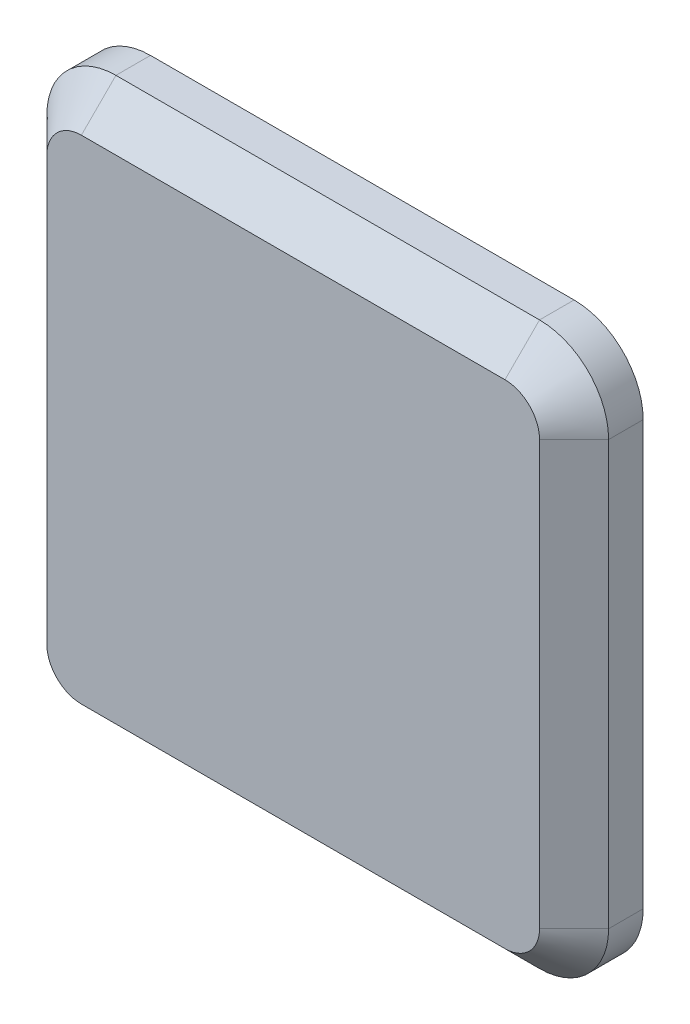
ISO-10303-21;
HEADER;
FILE_DESCRIPTION(('STEP AP214'),'2;1');
FILE_NAME('part.step','',(''),(''),'','','');
FILE_SCHEMA(('AUTOMOTIVE_DESIGN { 1 0 10303 214 1 1 1 1 }'));
ENDSEC;
DATA;
#1=APPLICATION_CONTEXT('core data for automotive mechanical design processes');
#2=APPLICATION_PROTOCOL_DEFINITION('international standard','automotive_design',2000,#1);
#3=PRODUCT_CONTEXT('',#1,'mechanical');
#4=PRODUCT('Part','Part','',(#3));
#5=PRODUCT_RELATED_PRODUCT_CATEGORY('part','',(#4));
#6=PRODUCT_DEFINITION_FORMATION('','',#4);
#7=PRODUCT_DEFINITION_CONTEXT('part definition',#1,'design');
#8=PRODUCT_DEFINITION('design','',#6,#7);
#9=PRODUCT_DEFINITION_SHAPE('','',#8);
#10=(LENGTH_UNIT() NAMED_UNIT(*) SI_UNIT(.MILLI.,.METRE.));
#11=(NAMED_UNIT(*) PLANE_ANGLE_UNIT() SI_UNIT($,.RADIAN.));
#12=(NAMED_UNIT(*) SI_UNIT($,.STERADIAN.) SOLID_ANGLE_UNIT());
#13=UNCERTAINTY_MEASURE_WITH_UNIT(LENGTH_MEASURE(1.E-05),#10,'distance_accuracy_value','');
#14=(GEOMETRIC_REPRESENTATION_CONTEXT(3) GLOBAL_UNCERTAINTY_ASSIGNED_CONTEXT((#13)) GLOBAL_UNIT_ASSIGNED_CONTEXT((#10,
#11,#12)) REPRESENTATION_CONTEXT('',''));
#15=CARTESIAN_POINT('',(0.,0.,0.));
#16=DIRECTION('',(0.,0.,1.));
#17=DIRECTION('',(1.,0.,0.));
#18=AXIS2_PLACEMENT_3D('',#15,#16,#17);
#19=CARTESIAN_POINT('',(-16.2634559672906,-16.2634559672906,4.));
#20=DIRECTION('',(1.,0.,0.));
#21=DIRECTION('',(0.,0.,-1.));
#22=AXIS2_PLACEMENT_3D('',#19,#20,#21);
#23=PLANE('',#22);
#24=DIRECTION('',(0.,0.,-1.));
#25=VECTOR('',#24,1.);
#26=CARTESIAN_POINT('',(-16.2634559672906,-12.2634559672906,4.));
#27=LINE('',#26,#25);
#28=CARTESIAN_POINT('',(-16.2634559672906,-12.2634559672906,0.));
#29=VERTEX_POINT('',#28);
#30=CARTESIAN_POINT('',(-16.2634559672906,-12.2634559672906,2.));
#31=VERTEX_POINT('',#30);
#32=EDGE_CURVE('E142',#29,#31,#27,.F.);
#33=ORIENTED_EDGE('',*,*,#32,.T.);
#34=DIRECTION('',(0.,1.,0.));
#35=VECTOR('',#34,1.);
#36=CARTESIAN_POINT('',(-16.2634559672906,12.2634559672906,2.));
#37=LINE('',#36,#35);
#38=CARTESIAN_POINT('',(-16.2634559672906,12.2634559672906,2.));
#39=VERTEX_POINT('',#38);
#40=EDGE_CURVE('E202',#31,#39,#37,.T.);
#41=ORIENTED_EDGE('',*,*,#40,.T.);
#42=DIRECTION('',(0.,0.,-1.));
#43=VECTOR('',#42,1.);
#44=CARTESIAN_POINT('',(-16.2634559672906,12.2634559672906,4.));
#45=LINE('',#44,#43);
#46=CARTESIAN_POINT('',(-16.2634559672906,12.2634559672906,0.));
#47=VERTEX_POINT('',#46);
#48=EDGE_CURVE('E146',#39,#47,#45,.T.);
#49=ORIENTED_EDGE('',*,*,#48,.T.);
#50=DIRECTION('',(0.,-1.,0.));
#51=VECTOR('',#50,1.);
#52=CARTESIAN_POINT('',(-16.2634559672906,-16.2634559672906,0.));
#53=LINE('',#52,#51);
#54=EDGE_CURVE('E153',#47,#29,#53,.T.);
#55=ORIENTED_EDGE('',*,*,#54,.T.);
#56=EDGE_LOOP('',(#33,#41,#49,#55));
#57=FACE_BOUND('',#56,.T.);
#58=ADVANCED_FACE('F34',(#57),#23,.F.);
#59=CARTESIAN_POINT('',(16.2634559672906,-16.2634559672906,4.));
#60=DIRECTION('',(0.,1.,0.));
#61=DIRECTION('',(-1.,0.,0.));
#62=AXIS2_PLACEMENT_3D('',#59,#60,#61);
#63=PLANE('',#62);
#64=DIRECTION('',(0.,0.,-1.));
#65=VECTOR('',#64,1.);
#66=CARTESIAN_POINT('',(12.2634559672906,-16.2634559672906,4.));
#67=LINE('',#66,#65);
#68=CARTESIAN_POINT('',(12.2634559672906,-16.2634559672906,0.));
#69=VERTEX_POINT('',#68);
#70=CARTESIAN_POINT('',(12.2634559672906,-16.2634559672906,2.));
#71=VERTEX_POINT('',#70);
#72=EDGE_CURVE('E136',#69,#71,#67,.F.);
#73=ORIENTED_EDGE('',*,*,#72,.T.);
#74=DIRECTION('',(-1.,0.,0.));
#75=VECTOR('',#74,1.);
#76=CARTESIAN_POINT('',(-12.2634559672906,-16.2634559672906,2.));
#77=LINE('',#76,#75);
#78=CARTESIAN_POINT('',(-12.2634559672906,-16.2634559672906,2.));
#79=VERTEX_POINT('',#78);
#80=EDGE_CURVE('E133',#71,#79,#77,.T.);
#81=ORIENTED_EDGE('',*,*,#80,.T.);
#82=DIRECTION('',(0.,0.,-1.));
#83=VECTOR('',#82,1.);
#84=CARTESIAN_POINT('',(-12.2634559672906,-16.2634559672906,4.));
#85=LINE('',#84,#83);
#86=CARTESIAN_POINT('',(-12.2634559672906,-16.2634559672906,0.));
#87=VERTEX_POINT('',#86);
#88=EDGE_CURVE('E125',#79,#87,#85,.T.);
#89=ORIENTED_EDGE('',*,*,#88,.T.);
#90=DIRECTION('',(1.,0.,0.));
#91=VECTOR('',#90,1.);
#92=CARTESIAN_POINT('',(16.2634559672906,-16.2634559672906,0.));
#93=LINE('',#92,#91);
#94=EDGE_CURVE('E130',#87,#69,#93,.T.);
#95=ORIENTED_EDGE('',*,*,#94,.T.);
#96=EDGE_LOOP('',(#73,#81,#89,#95));
#97=FACE_BOUND('',#96,.T.);
#98=ADVANCED_FACE('F128',(#97),#63,.F.);
#99=CARTESIAN_POINT('',(16.2634559672906,-16.2634559672906,4.));
#100=DIRECTION('',(-1.,0.,0.));
#101=DIRECTION('',(0.,0.,1.));
#102=AXIS2_PLACEMENT_3D('',#99,#100,#101);
#103=PLANE('',#102);
#104=DIRECTION('',(0.,0.,-1.));
#105=VECTOR('',#104,1.);
#106=CARTESIAN_POINT('',(16.2634559672906,12.2634559672906,4.));
#107=LINE('',#106,#105);
#108=CARTESIAN_POINT('',(16.2634559672906,12.2634559672906,0.));
#109=VERTEX_POINT('',#108);
#110=CARTESIAN_POINT('',(16.2634559672906,12.2634559672906,2.));
#111=VERTEX_POINT('',#110);
#112=EDGE_CURVE('E169',#109,#111,#107,.F.);
#113=ORIENTED_EDGE('',*,*,#112,.T.);
#114=DIRECTION('',(0.,-1.,0.));
#115=VECTOR('',#114,1.);
#116=CARTESIAN_POINT('',(16.2634559672906,-12.2634559672906,2.));
#117=LINE('',#116,#115);
#118=CARTESIAN_POINT('',(16.2634559672906,-12.2634559672906,2.));
#119=VERTEX_POINT('',#118);
#120=EDGE_CURVE('E200',#111,#119,#117,.T.);
#121=ORIENTED_EDGE('',*,*,#120,.T.);
#122=DIRECTION('',(0.,0.,-1.));
#123=VECTOR('',#122,1.);
#124=CARTESIAN_POINT('',(16.2634559672906,-12.2634559672906,4.));
#125=LINE('',#124,#123);
#126=CARTESIAN_POINT('',(16.2634559672906,-12.2634559672906,0.));
#127=VERTEX_POINT('',#126);
#128=EDGE_CURVE('E172',#119,#127,#125,.T.);
#129=ORIENTED_EDGE('',*,*,#128,.T.);
#130=DIRECTION('',(0.,1.,0.));
#131=VECTOR('',#130,1.);
#132=CARTESIAN_POINT('',(16.2634559672906,-16.2634559672906,0.));
#133=LINE('',#132,#131);
#134=EDGE_CURVE('E152',#127,#109,#133,.T.);
#135=ORIENTED_EDGE('',*,*,#134,.T.);
#136=EDGE_LOOP('',(#113,#121,#129,#135));
#137=FACE_BOUND('',#136,.T.);
#138=ADVANCED_FACE('F244',(#137),#103,.F.);
#139=CARTESIAN_POINT('',(16.2634559672906,16.2634559672906,4.));
#140=DIRECTION('',(0.,-1.,0.));
#141=DIRECTION('',(1.,0.,0.));
#142=AXIS2_PLACEMENT_3D('',#139,#140,#141);
#143=PLANE('',#142);
#144=DIRECTION('',(0.,0.,-1.));
#145=VECTOR('',#144,1.);
#146=CARTESIAN_POINT('',(-12.2634559672906,16.2634559672906,4.));
#147=LINE('',#146,#145);
#148=CARTESIAN_POINT('',(-12.2634559672906,16.2634559672906,0.));
#149=VERTEX_POINT('',#148);
#150=CARTESIAN_POINT('',(-12.2634559672906,16.2634559672906,2.));
#151=VERTEX_POINT('',#150);
#152=EDGE_CURVE('E174',#149,#151,#147,.F.);
#153=ORIENTED_EDGE('',*,*,#152,.T.);
#154=DIRECTION('',(1.,0.,0.));
#155=VECTOR('',#154,1.);
#156=CARTESIAN_POINT('',(12.2634559672906,16.2634559672906,2.));
#157=LINE('',#156,#155);
#158=CARTESIAN_POINT('',(12.2634559672906,16.2634559672906,2.));
#159=VERTEX_POINT('',#158);
#160=EDGE_CURVE('E11',#151,#159,#157,.T.);
#161=ORIENTED_EDGE('',*,*,#160,.T.);
#162=DIRECTION('',(0.,0.,-1.));
#163=VECTOR('',#162,1.);
#164=CARTESIAN_POINT('',(12.2634559672906,16.2634559672906,4.));
#165=LINE('',#164,#163);
#166=CARTESIAN_POINT('',(12.2634559672906,16.2634559672906,0.));
#167=VERTEX_POINT('',#166);
#168=EDGE_CURVE('E176',#159,#167,#165,.T.);
#169=ORIENTED_EDGE('',*,*,#168,.T.);
#170=DIRECTION('',(-1.,0.,0.));
#171=VECTOR('',#170,1.);
#172=CARTESIAN_POINT('',(16.2634559672906,16.2634559672906,0.));
#173=LINE('',#172,#171);
#174=EDGE_CURVE('E156',#167,#149,#173,.T.);
#175=ORIENTED_EDGE('',*,*,#174,.T.);
#176=EDGE_LOOP('',(#153,#161,#169,#175));
#177=FACE_BOUND('',#176,.T.);
#178=ADVANCED_FACE('F248',(#177),#143,.F.);
#179=CARTESIAN_POINT('',(0.,0.,4.));
#180=DIRECTION('',(0.,0.,1.));
#181=DIRECTION('',(1.,0.,0.));
#182=AXIS2_PLACEMENT_3D('',#179,#180,#181);
#183=PLANE('',#182);
#184=CARTESIAN_POINT('',(-12.2634559672906,-12.2634559672906,4.));
#185=DIRECTION('',(0.,0.,1.));
#186=DIRECTION('',(1.,0.,0.));
#187=AXIS2_PLACEMENT_3D('',#184,#185,#186);
#188=CIRCLE('',#187,2.00000000000001);
#189=CARTESIAN_POINT('',(-14.2634559672906,-12.2634559672906,4.));
#190=VERTEX_POINT('',#189);
#191=CARTESIAN_POINT('',(-12.2634559672906,-14.2634559672906,4.));
#192=VERTEX_POINT('',#191);
#193=EDGE_CURVE('E188',#190,#192,#188,.T.);
#194=ORIENTED_EDGE('',*,*,#193,.T.);
#195=DIRECTION('',(1.,0.,0.));
#196=VECTOR('',#195,1.);
#197=CARTESIAN_POINT('',(12.2634559672906,-14.2634559672906,4.));
#198=LINE('',#197,#196);
#199=CARTESIAN_POINT('',(12.2634559672906,-14.2634559672906,4.));
#200=VERTEX_POINT('',#199);
#201=EDGE_CURVE('E192',#192,#200,#198,.T.);
#202=ORIENTED_EDGE('',*,*,#201,.T.);
#203=CARTESIAN_POINT('',(12.2634559672906,-12.2634559672906,4.));
#204=DIRECTION('',(0.,0.,1.));
#205=DIRECTION('',(1.,0.,0.));
#206=AXIS2_PLACEMENT_3D('',#203,#204,#205);
#207=CIRCLE('',#206,2.00000000000001);
#208=CARTESIAN_POINT('',(14.2634559672906,-12.2634559672906,4.));
#209=VERTEX_POINT('',#208);
#210=EDGE_CURVE('E190',#200,#209,#207,.T.);
#211=ORIENTED_EDGE('',*,*,#210,.T.);
#212=DIRECTION('',(0.,1.,0.));
#213=VECTOR('',#212,1.);
#214=CARTESIAN_POINT('',(14.2634559672906,12.2634559672906,4.));
#215=LINE('',#214,#213);
#216=CARTESIAN_POINT('',(14.2634559672906,12.2634559672906,4.));
#217=VERTEX_POINT('',#216);
#218=EDGE_CURVE('E186',#209,#217,#215,.T.);
#219=ORIENTED_EDGE('',*,*,#218,.T.);
#220=CARTESIAN_POINT('',(12.2634559672906,12.2634559672906,4.));
#221=DIRECTION('',(0.,0.,1.));
#222=DIRECTION('',(1.,0.,0.));
#223=AXIS2_PLACEMENT_3D('',#220,#221,#222);
#224=CIRCLE('',#223,2.00000000000001);
#225=CARTESIAN_POINT('',(12.2634559672906,14.2634559672906,4.));
#226=VERTEX_POINT('',#225);
#227=EDGE_CURVE('E182',#217,#226,#224,.T.);
#228=ORIENTED_EDGE('',*,*,#227,.T.);
#229=DIRECTION('',(-1.,0.,0.));
#230=VECTOR('',#229,1.);
#231=CARTESIAN_POINT('',(-12.2634559672906,14.2634559672906,4.));
#232=LINE('',#231,#230);
#233=CARTESIAN_POINT('',(-12.2634559672906,14.2634559672906,4.));
#234=VERTEX_POINT('',#233);
#235=EDGE_CURVE('E178',#226,#234,#232,.T.);
#236=ORIENTED_EDGE('',*,*,#235,.T.);
#237=CARTESIAN_POINT('',(-12.2634559672906,12.2634559672906,4.));
#238=DIRECTION('',(0.,0.,1.));
#239=DIRECTION('',(1.,0.,0.));
#240=AXIS2_PLACEMENT_3D('',#237,#238,#239);
#241=CIRCLE('',#240,2.00000000000001);
#242=CARTESIAN_POINT('',(-14.2634559672906,12.2634559672906,4.));
#243=VERTEX_POINT('',#242);
#244=EDGE_CURVE('E180',#234,#243,#241,.T.);
#245=ORIENTED_EDGE('',*,*,#244,.T.);
#246=DIRECTION('',(0.,-1.,0.));
#247=VECTOR('',#246,1.);
#248=CARTESIAN_POINT('',(-14.2634559672906,-12.2634559672906,4.));
#249=LINE('',#248,#247);
#250=EDGE_CURVE('E184',#243,#190,#249,.T.);
#251=ORIENTED_EDGE('',*,*,#250,.T.);
#252=EDGE_LOOP('',(#194,#202,#211,#219,#228,#236,#245,#251));
#253=FACE_BOUND('',#252,.T.);
#254=ADVANCED_FACE('F263',(#253),#183,.T.);
#255=CARTESIAN_POINT('',(0.,0.,0.));
#256=DIRECTION('',(0.,0.,1.));
#257=DIRECTION('',(1.,0.,0.));
#258=AXIS2_PLACEMENT_3D('',#255,#256,#257);
#259=PLANE('',#258);
#260=ORIENTED_EDGE('',*,*,#94,.F.);
#261=CARTESIAN_POINT('',(-12.2634559672906,-12.2634559672906,0.));
#262=DIRECTION('',(0.,0.,1.));
#263=DIRECTION('',(1.,0.,0.));
#264=AXIS2_PLACEMENT_3D('',#261,#262,#263);
#265=CIRCLE('',#264,4.);
#266=EDGE_CURVE('E139',#87,#29,#265,.F.);
#267=ORIENTED_EDGE('',*,*,#266,.T.);
#268=ORIENTED_EDGE('',*,*,#54,.F.);
#269=CARTESIAN_POINT('',(-12.2634559672906,12.2634559672906,0.));
#270=DIRECTION('',(0.,0.,1.));
#271=DIRECTION('',(1.,0.,0.));
#272=AXIS2_PLACEMENT_3D('',#269,#270,#271);
#273=CIRCLE('',#272,4.);
#274=EDGE_CURVE('E135',#47,#149,#273,.F.);
#275=ORIENTED_EDGE('',*,*,#274,.T.);
#276=ORIENTED_EDGE('',*,*,#174,.F.);
#277=CARTESIAN_POINT('',(12.2634559672906,12.2634559672906,0.));
#278=DIRECTION('',(0.,0.,1.));
#279=DIRECTION('',(1.,0.,0.));
#280=AXIS2_PLACEMENT_3D('',#277,#278,#279);
#281=CIRCLE('',#280,4.);
#282=EDGE_CURVE('E164',#167,#109,#281,.F.);
#283=ORIENTED_EDGE('',*,*,#282,.T.);
#284=ORIENTED_EDGE('',*,*,#134,.F.);
#285=CARTESIAN_POINT('',(12.2634559672906,-12.2634559672906,0.));
#286=DIRECTION('',(0.,0.,1.));
#287=DIRECTION('',(1.,0.,0.));
#288=AXIS2_PLACEMENT_3D('',#285,#286,#287);
#289=CIRCLE('',#288,4.);
#290=EDGE_CURVE('E147',#127,#69,#289,.F.);
#291=ORIENTED_EDGE('',*,*,#290,.T.);
#292=EDGE_LOOP('',(#260,#267,#268,#275,#276,#283,#284,#291));
#293=FACE_BOUND('',#292,.T.);
#294=ADVANCED_FACE('F149',(#293),#259,.F.);
#295=CARTESIAN_POINT('',(-12.2634559672906,-12.2634559672906,4.));
#296=DIRECTION('',(0.,0.,-1.));
#297=DIRECTION('',(-1.,0.,0.));
#298=AXIS2_PLACEMENT_3D('',#295,#296,#297);
#299=CYLINDRICAL_SURFACE('',#298,4.);
#300=ORIENTED_EDGE('',*,*,#88,.F.);
#301=CARTESIAN_POINT('',(-12.2634559672906,-12.2634559672906,2.));
#302=DIRECTION('',(0.,0.,1.));
#303=DIRECTION('',(1.,0.,0.));
#304=AXIS2_PLACEMENT_3D('',#301,#302,#303);
#305=CIRCLE('',#304,4.);
#306=EDGE_CURVE('E198',#79,#31,#305,.F.);
#307=ORIENTED_EDGE('',*,*,#306,.T.);
#308=ORIENTED_EDGE('',*,*,#32,.F.);
#309=ORIENTED_EDGE('',*,*,#266,.F.);
#310=EDGE_LOOP('',(#300,#307,#308,#309));
#311=FACE_BOUND('',#310,.T.);
#312=ADVANCED_FACE('F140',(#311),#299,.T.);
#313=CARTESIAN_POINT('',(12.2634559672906,-12.2634559672906,4.));
#314=DIRECTION('',(0.,0.,-1.));
#315=DIRECTION('',(-1.,0.,0.));
#316=AXIS2_PLACEMENT_3D('',#313,#314,#315);
#317=CYLINDRICAL_SURFACE('',#316,4.);
#318=ORIENTED_EDGE('',*,*,#128,.F.);
#319=CARTESIAN_POINT('',(12.2634559672906,-12.2634559672906,2.));
#320=DIRECTION('',(0.,0.,1.));
#321=DIRECTION('',(1.,0.,0.));
#322=AXIS2_PLACEMENT_3D('',#319,#320,#321);
#323=CIRCLE('',#322,4.);
#324=EDGE_CURVE('E196',#119,#71,#323,.F.);
#325=ORIENTED_EDGE('',*,*,#324,.T.);
#326=ORIENTED_EDGE('',*,*,#72,.F.);
#327=ORIENTED_EDGE('',*,*,#290,.F.);
#328=EDGE_LOOP('',(#318,#325,#326,#327));
#329=FACE_BOUND('',#328,.T.);
#330=ADVANCED_FACE('F274',(#329),#317,.T.);
#331=CARTESIAN_POINT('',(12.2634559672906,12.2634559672906,4.));
#332=DIRECTION('',(0.,0.,-1.));
#333=DIRECTION('',(-1.,0.,0.));
#334=AXIS2_PLACEMENT_3D('',#331,#332,#333);
#335=CYLINDRICAL_SURFACE('',#334,4.);
#336=ORIENTED_EDGE('',*,*,#168,.F.);
#337=CARTESIAN_POINT('',(12.2634559672906,12.2634559672906,2.));
#338=DIRECTION('',(0.,0.,1.));
#339=DIRECTION('',(1.,0.,0.));
#340=AXIS2_PLACEMENT_3D('',#337,#338,#339);
#341=CIRCLE('',#340,4.);
#342=EDGE_CURVE('E204',#159,#111,#341,.F.);
#343=ORIENTED_EDGE('',*,*,#342,.T.);
#344=ORIENTED_EDGE('',*,*,#112,.F.);
#345=ORIENTED_EDGE('',*,*,#282,.F.);
#346=EDGE_LOOP('',(#336,#343,#344,#345));
#347=FACE_BOUND('',#346,.T.);
#348=ADVANCED_FACE('F241',(#347),#335,.T.);
#349=CARTESIAN_POINT('',(-12.2634559672906,12.2634559672906,4.));
#350=DIRECTION('',(0.,0.,-1.));
#351=DIRECTION('',(-1.,0.,0.));
#352=AXIS2_PLACEMENT_3D('',#349,#350,#351);
#353=CYLINDRICAL_SURFACE('',#352,4.);
#354=ORIENTED_EDGE('',*,*,#48,.F.);
#355=CARTESIAN_POINT('',(-12.2634559672906,12.2634559672906,2.));
#356=DIRECTION('',(0.,0.,1.));
#357=DIRECTION('',(1.,0.,0.));
#358=AXIS2_PLACEMENT_3D('',#355,#356,#357);
#359=CIRCLE('',#358,4.);
#360=EDGE_CURVE('E43',#39,#151,#359,.F.);
#361=ORIENTED_EDGE('',*,*,#360,.T.);
#362=ORIENTED_EDGE('',*,*,#152,.F.);
#363=ORIENTED_EDGE('',*,*,#274,.F.);
#364=EDGE_LOOP('',(#354,#361,#362,#363));
#365=FACE_BOUND('',#364,.T.);
#366=ADVANCED_FACE('F249',(#365),#353,.T.);
#367=CARTESIAN_POINT('',(0.,14.2634559672906,4.));
#368=DIRECTION('',(0.,0.70710678118655,0.707106781186545));
#369=DIRECTION('',(1.,0.,0.));
#370=AXIS2_PLACEMENT_3D('',#367,#368,#369);
#371=PLANE('',#370);
#372=DIRECTION('',(0.,-0.707106781186545,0.70710678118655));
#373=VECTOR('',#372,1.);
#374=CARTESIAN_POINT('',(12.2634559672906,16.2634559672906,2.));
#375=LINE('',#374,#373);
#376=EDGE_CURVE('E222',#159,#226,#375,.T.);
#377=ORIENTED_EDGE('',*,*,#376,.F.);
#378=ORIENTED_EDGE('',*,*,#160,.F.);
#379=DIRECTION('',(0.,0.707106781186545,-0.70710678118655));
#380=VECTOR('',#379,1.);
#381=CARTESIAN_POINT('',(-12.2634559672906,14.2634559672906,4.));
#382=LINE('',#381,#380);
#383=EDGE_CURVE('E38',#234,#151,#382,.T.);
#384=ORIENTED_EDGE('',*,*,#383,.F.);
#385=ORIENTED_EDGE('',*,*,#235,.F.);
#386=EDGE_LOOP('',(#377,#378,#384,#385));
#387=FACE_BOUND('',#386,.T.);
#388=ADVANCED_FACE('F36',(#387),#371,.T.);
#389=CARTESIAN_POINT('',(-12.2634559672906,12.2634559672906,4.));
#390=DIRECTION('',(0.,0.,-1.));
#391=DIRECTION('',(-1.,0.,0.));
#392=AXIS2_PLACEMENT_3D('',#389,#390,#391);
#393=CONICAL_SURFACE('',#392,2.00000000000001,0.785398163397445);
#394=ORIENTED_EDGE('',*,*,#383,.T.);
#395=ORIENTED_EDGE('',*,*,#360,.F.);
#396=DIRECTION('',(-0.707106781186545,0.,-0.70710678118655));
#397=VECTOR('',#396,1.);
#398=CARTESIAN_POINT('',(-14.2634559672906,12.2634559672906,4.));
#399=LINE('',#398,#397);
#400=EDGE_CURVE('E220',#243,#39,#399,.T.);
#401=ORIENTED_EDGE('',*,*,#400,.F.);
#402=ORIENTED_EDGE('',*,*,#244,.F.);
#403=EDGE_LOOP('',(#394,#395,#401,#402));
#404=FACE_BOUND('',#403,.T.);
#405=ADVANCED_FACE('F232',(#404),#393,.T.);
#406=CARTESIAN_POINT('',(12.2634559672906,12.2634559672906,4.));
#407=DIRECTION('',(0.,0.,-1.));
#408=DIRECTION('',(-1.,0.,0.));
#409=AXIS2_PLACEMENT_3D('',#406,#407,#408);
#410=CONICAL_SURFACE('',#409,2.00000000000001,0.785398163397445);
#411=ORIENTED_EDGE('',*,*,#376,.T.);
#412=ORIENTED_EDGE('',*,*,#227,.F.);
#413=DIRECTION('',(-0.707106781186545,0.,0.70710678118655));
#414=VECTOR('',#413,1.);
#415=CARTESIAN_POINT('',(16.2634559672906,12.2634559672906,2.));
#416=LINE('',#415,#414);
#417=EDGE_CURVE('E217',#111,#217,#416,.T.);
#418=ORIENTED_EDGE('',*,*,#417,.F.);
#419=ORIENTED_EDGE('',*,*,#342,.F.);
#420=EDGE_LOOP('',(#411,#412,#418,#419));
#421=FACE_BOUND('',#420,.T.);
#422=ADVANCED_FACE('F237',(#421),#410,.T.);
#423=CARTESIAN_POINT('',(-14.2634559672906,0.,4.));
#424=DIRECTION('',(-0.70710678118655,0.,0.707106781186545));
#425=DIRECTION('',(0.,1.,0.));
#426=AXIS2_PLACEMENT_3D('',#423,#424,#425);
#427=PLANE('',#426);
#428=ORIENTED_EDGE('',*,*,#400,.T.);
#429=ORIENTED_EDGE('',*,*,#40,.F.);
#430=DIRECTION('',(-0.707106781186545,0.,-0.70710678118655));
#431=VECTOR('',#430,1.);
#432=CARTESIAN_POINT('',(-14.2634559672906,-12.2634559672906,4.));
#433=LINE('',#432,#431);
#434=EDGE_CURVE('E214',#190,#31,#433,.T.);
#435=ORIENTED_EDGE('',*,*,#434,.F.);
#436=ORIENTED_EDGE('',*,*,#250,.F.);
#437=EDGE_LOOP('',(#428,#429,#435,#436));
#438=FACE_BOUND('',#437,.T.);
#439=ADVANCED_FACE('F254',(#438),#427,.T.);
#440=CARTESIAN_POINT('',(14.2634559672906,0.,4.));
#441=DIRECTION('',(0.70710678118655,0.,0.707106781186545));
#442=DIRECTION('',(0.,-1.,0.));
#443=AXIS2_PLACEMENT_3D('',#440,#441,#442);
#444=PLANE('',#443);
#445=ORIENTED_EDGE('',*,*,#417,.T.);
#446=ORIENTED_EDGE('',*,*,#218,.F.);
#447=DIRECTION('',(-0.707106781186545,0.,0.70710678118655));
#448=VECTOR('',#447,1.);
#449=CARTESIAN_POINT('',(16.2634559672906,-12.2634559672906,2.));
#450=LINE('',#449,#448);
#451=EDGE_CURVE('E211',#119,#209,#450,.T.);
#452=ORIENTED_EDGE('',*,*,#451,.F.);
#453=ORIENTED_EDGE('',*,*,#120,.F.);
#454=EDGE_LOOP('',(#445,#446,#452,#453));
#455=FACE_BOUND('',#454,.T.);
#456=ADVANCED_FACE('F266',(#455),#444,.T.);
#457=CARTESIAN_POINT('',(-12.2634559672906,-12.2634559672906,4.));
#458=DIRECTION('',(0.,0.,-1.));
#459=DIRECTION('',(-1.,0.,0.));
#460=AXIS2_PLACEMENT_3D('',#457,#458,#459);
#461=CONICAL_SURFACE('',#460,2.00000000000001,0.785398163397445);
#462=ORIENTED_EDGE('',*,*,#434,.T.);
#463=ORIENTED_EDGE('',*,*,#306,.F.);
#464=DIRECTION('',(0.,-0.707106781186545,-0.70710678118655));
#465=VECTOR('',#464,1.);
#466=CARTESIAN_POINT('',(-12.2634559672906,-14.2634559672906,4.));
#467=LINE('',#466,#465);
#468=EDGE_CURVE('E209',#192,#79,#467,.T.);
#469=ORIENTED_EDGE('',*,*,#468,.F.);
#470=ORIENTED_EDGE('',*,*,#193,.F.);
#471=EDGE_LOOP('',(#462,#463,#469,#470));
#472=FACE_BOUND('',#471,.T.);
#473=ADVANCED_FACE('F259',(#472),#461,.T.);
#474=CARTESIAN_POINT('',(12.2634559672906,-12.2634559672906,4.));
#475=DIRECTION('',(0.,0.,-1.));
#476=DIRECTION('',(-1.,0.,0.));
#477=AXIS2_PLACEMENT_3D('',#474,#475,#476);
#478=CONICAL_SURFACE('',#477,2.00000000000001,0.785398163397445);
#479=ORIENTED_EDGE('',*,*,#451,.T.);
#480=ORIENTED_EDGE('',*,*,#210,.F.);
#481=DIRECTION('',(0.,0.707106781186545,0.70710678118655));
#482=VECTOR('',#481,1.);
#483=CARTESIAN_POINT('',(12.2634559672906,-16.2634559672906,2.));
#484=LINE('',#483,#482);
#485=EDGE_CURVE('E207',#71,#200,#484,.T.);
#486=ORIENTED_EDGE('',*,*,#485,.F.);
#487=ORIENTED_EDGE('',*,*,#324,.F.);
#488=EDGE_LOOP('',(#479,#480,#486,#487));
#489=FACE_BOUND('',#488,.T.);
#490=ADVANCED_FACE('F272',(#489),#478,.T.);
#491=CARTESIAN_POINT('',(0.,-14.2634559672906,4.));
#492=DIRECTION('',(0.,-0.70710678118655,0.707106781186545));
#493=DIRECTION('',(-1.,0.,0.));
#494=AXIS2_PLACEMENT_3D('',#491,#492,#493);
#495=PLANE('',#494);
#496=ORIENTED_EDGE('',*,*,#468,.T.);
#497=ORIENTED_EDGE('',*,*,#80,.F.);
#498=ORIENTED_EDGE('',*,*,#485,.T.);
#499=ORIENTED_EDGE('',*,*,#201,.F.);
#500=EDGE_LOOP('',(#496,#497,#498,#499));
#501=FACE_BOUND('',#500,.T.);
#502=ADVANCED_FACE('F276',(#501),#495,.T.);
#503=CLOSED_SHELL('',(#58,#98,#138,#178,#254,#294,#312,#330,#348,#366,#388,#405,#422,#439,#456,
#473,#490,#502));
#504=MANIFOLD_SOLID_BREP('B2',#503);
#505=ADVANCED_BREP_SHAPE_REPRESENTATION('',(#18,#504),#14);
#506=SHAPE_DEFINITION_REPRESENTATION(#9,#505);
ENDSEC;
END-ISO-10303-21;
